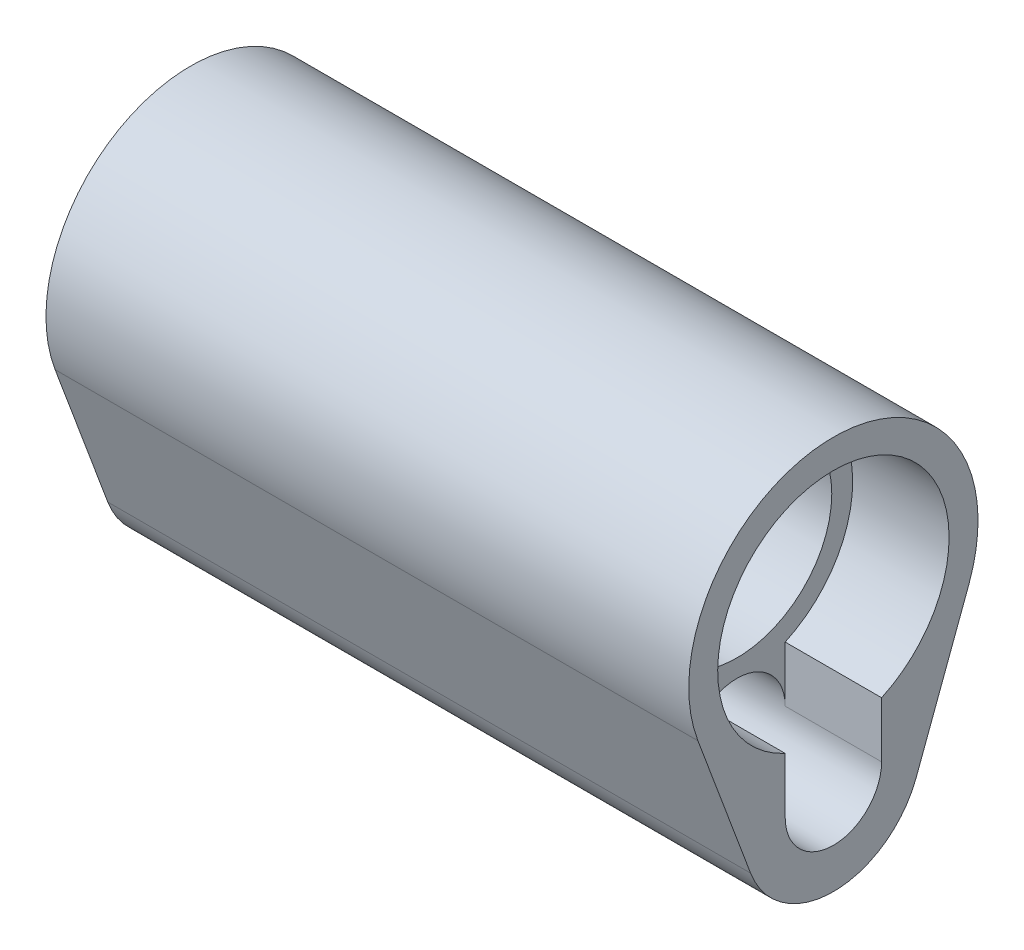
ISO-10303-21;
HEADER;
FILE_DESCRIPTION(('STEP AP214'),'2;1');
FILE_NAME('part.step','',(''),(''),'','','');
FILE_SCHEMA(('AUTOMOTIVE_DESIGN { 1 0 10303 214 1 1 1 1 }'));
ENDSEC;
DATA;
#1=APPLICATION_CONTEXT('core data for automotive mechanical design processes');
#2=APPLICATION_PROTOCOL_DEFINITION('international standard','automotive_design',2000,#1);
#3=PRODUCT_CONTEXT('',#1,'mechanical');
#4=PRODUCT('Part','Part','',(#3));
#5=PRODUCT_RELATED_PRODUCT_CATEGORY('part','',(#4));
#6=PRODUCT_DEFINITION_FORMATION('','',#4);
#7=PRODUCT_DEFINITION_CONTEXT('part definition',#1,'design');
#8=PRODUCT_DEFINITION('design','',#6,#7);
#9=PRODUCT_DEFINITION_SHAPE('','',#8);
#10=(LENGTH_UNIT() NAMED_UNIT(*) SI_UNIT(.MILLI.,.METRE.));
#11=(NAMED_UNIT(*) PLANE_ANGLE_UNIT() SI_UNIT($,.RADIAN.));
#12=(NAMED_UNIT(*) SI_UNIT($,.STERADIAN.) SOLID_ANGLE_UNIT());
#13=UNCERTAINTY_MEASURE_WITH_UNIT(LENGTH_MEASURE(1.E-05),#10,'distance_accuracy_value','');
#14=(GEOMETRIC_REPRESENTATION_CONTEXT(3) GLOBAL_UNCERTAINTY_ASSIGNED_CONTEXT((#13)) GLOBAL_UNIT_ASSIGNED_CONTEXT((#10,
#11,#12)) REPRESENTATION_CONTEXT('',''));
#15=CARTESIAN_POINT('',(0.,0.,0.));
#16=DIRECTION('',(0.,0.,1.));
#17=DIRECTION('',(1.,0.,0.));
#18=AXIS2_PLACEMENT_3D('',#15,#16,#17);
#19=CARTESIAN_POINT('',(20.,0.,0.));
#20=DIRECTION('',(-1.,0.,0.));
#21=DIRECTION('',(0.,0.,1.));
#22=AXIS2_PLACEMENT_3D('',#19,#20,#21);
#23=CYLINDRICAL_SURFACE('',#22,2.95);
#24=CARTESIAN_POINT('',(0.,0.,0.));
#25=DIRECTION('',(1.,0.,0.));
#26=DIRECTION('',(0.,0.,-1.));
#27=AXIS2_PLACEMENT_3D('',#24,#25,#26);
#28=CIRCLE('',#27,2.95);
#29=CARTESIAN_POINT('',(0.,0.,-2.95));
#30=VERTEX_POINT('',#29);
#31=EDGE_CURVE('E141',#30,#30,#28,.T.);
#32=ORIENTED_EDGE('',*,*,#31,.F.);
#33=EDGE_LOOP('',(#32));
#34=FACE_BOUND('',#33,.T.);
#35=CARTESIAN_POINT('',(17.,0.,0.));
#36=DIRECTION('',(1.,0.,0.));
#37=DIRECTION('',(0.,0.,-1.));
#38=AXIS2_PLACEMENT_3D('',#35,#36,#37);
#39=CIRCLE('',#38,2.95);
#40=CARTESIAN_POINT('',(17.,0.,-2.95));
#41=VERTEX_POINT('',#40);
#42=EDGE_CURVE('E136',#41,#41,#39,.T.);
#43=ORIENTED_EDGE('',*,*,#42,.T.);
#44=EDGE_LOOP('',(#43));
#45=FACE_BOUND('',#44,.T.);
#46=ADVANCED_FACE('F35',(#34,#45),#23,.F.);
#47=CARTESIAN_POINT('',(20.,0.,0.));
#48=DIRECTION('',(1.,0.,0.));
#49=DIRECTION('',(0.,0.,-1.));
#50=AXIS2_PLACEMENT_3D('',#47,#48,#49);
#51=PLANE('',#50);
#52=DIRECTION('',(0.,-1.,0.));
#53=VECTOR('',#52,1.);
#54=CARTESIAN_POINT('',(20.,-5.,1.5));
#55=LINE('',#54,#53);
#56=CARTESIAN_POINT('',(20.,-3.27261363439071,1.5));
#57=VERTEX_POINT('',#56);
#58=CARTESIAN_POINT('',(20.,-5.,1.5));
#59=VERTEX_POINT('',#58);
#60=EDGE_CURVE('E288',#57,#59,#55,.T.);
#61=ORIENTED_EDGE('',*,*,#60,.F.);
#62=CARTESIAN_POINT('',(20.,0.,0.));
#63=DIRECTION('',(1.,0.,0.));
#64=DIRECTION('',(0.,0.,-1.));
#65=AXIS2_PLACEMENT_3D('',#62,#63,#64);
#66=CIRCLE('',#65,3.6);
#67=CARTESIAN_POINT('',(20.,-3.27261363439071,-1.5));
#68=VERTEX_POINT('',#67);
#69=EDGE_CURVE('E285',#68,#57,#66,.T.);
#70=ORIENTED_EDGE('',*,*,#69,.F.);
#71=DIRECTION('',(0.,1.,0.));
#72=VECTOR('',#71,1.);
#73=CARTESIAN_POINT('',(20.,-5.,-1.5));
#74=LINE('',#73,#72);
#75=CARTESIAN_POINT('',(20.,-5.,-1.5));
#76=VERTEX_POINT('',#75);
#77=EDGE_CURVE('E286',#76,#68,#74,.T.);
#78=ORIENTED_EDGE('',*,*,#77,.F.);
#79=CARTESIAN_POINT('',(20.,-5.,0.));
#80=DIRECTION('',(1.,0.,0.));
#81=DIRECTION('',(0.,0.,-1.));
#82=AXIS2_PLACEMENT_3D('',#79,#80,#81);
#83=CIRCLE('',#82,1.5);
#84=EDGE_CURVE('E128',#59,#76,#83,.T.);
#85=ORIENTED_EDGE('',*,*,#84,.F.);
#86=EDGE_LOOP('',(#61,#70,#78,#85));
#87=FACE_BOUND('',#86,.T.);
#88=CARTESIAN_POINT('',(20.,0.,0.));
#89=DIRECTION('',(1.,0.,0.));
#90=DIRECTION('',(0.,0.,-1.));
#91=AXIS2_PLACEMENT_3D('',#88,#89,#90);
#92=CIRCLE('',#91,4.5);
#93=CARTESIAN_POINT('',(20.,-1.575,-4.21537364891892));
#94=VERTEX_POINT('',#93);
#95=CARTESIAN_POINT('',(20.,-1.575,4.21537364891892));
#96=VERTEX_POINT('',#95);
#97=EDGE_CURVE('E147',#94,#96,#92,.T.);
#98=ORIENTED_EDGE('',*,*,#97,.T.);
#99=DIRECTION('',(0.,-0.93674969975976,-0.35));
#100=VECTOR('',#99,1.);
#101=CARTESIAN_POINT('',(20.,-1.575,4.21537364891892));
#102=LINE('',#101,#100);
#103=CARTESIAN_POINT('',(20.,-5.9625,2.57606167433934));
#104=VERTEX_POINT('',#103);
#105=EDGE_CURVE('E88',#96,#104,#102,.T.);
#106=ORIENTED_EDGE('',*,*,#105,.T.);
#107=CARTESIAN_POINT('',(20.,-5.,0.));
#108=DIRECTION('',(1.,0.,0.));
#109=DIRECTION('',(0.,0.,-1.));
#110=AXIS2_PLACEMENT_3D('',#107,#108,#109);
#111=CIRCLE('',#110,2.75);
#112=CARTESIAN_POINT('',(20.,-5.9625,-2.57606167433934));
#113=VERTEX_POINT('',#112);
#114=EDGE_CURVE('E150',#104,#113,#111,.T.);
#115=ORIENTED_EDGE('',*,*,#114,.T.);
#116=DIRECTION('',(0.,0.93674969975976,-0.35));
#117=VECTOR('',#116,1.);
#118=CARTESIAN_POINT('',(20.,-1.575,-4.21537364891892));
#119=LINE('',#118,#117);
#120=EDGE_CURVE('E59',#113,#94,#119,.T.);
#121=ORIENTED_EDGE('',*,*,#120,.T.);
#122=EDGE_LOOP('',(#98,#106,#115,#121));
#123=FACE_BOUND('',#122,.T.);
#124=ADVANCED_FACE('F180',(#87,#123),#51,.T.);
#125=CARTESIAN_POINT('',(0.,0.,0.));
#126=DIRECTION('',(1.,0.,0.));
#127=DIRECTION('',(0.,0.,-1.));
#128=AXIS2_PLACEMENT_3D('',#125,#126,#127);
#129=PLANE('',#128);
#130=CARTESIAN_POINT('',(0.,0.,0.));
#131=DIRECTION('',(1.,0.,0.));
#132=DIRECTION('',(0.,0.,-1.));
#133=AXIS2_PLACEMENT_3D('',#130,#131,#132);
#134=CIRCLE('',#133,4.5);
#135=CARTESIAN_POINT('',(0.,-1.575,-4.21537364891892));
#136=VERTEX_POINT('',#135);
#137=CARTESIAN_POINT('',(0.,-1.575,4.21537364891892));
#138=VERTEX_POINT('',#137);
#139=EDGE_CURVE('E146',#136,#138,#134,.T.);
#140=ORIENTED_EDGE('',*,*,#139,.F.);
#141=DIRECTION('',(0.,0.93674969975976,-0.35));
#142=VECTOR('',#141,1.);
#143=CARTESIAN_POINT('',(0.,-1.575,-4.21537364891892));
#144=LINE('',#143,#142);
#145=CARTESIAN_POINT('',(0.,-5.9625,-2.57606167433934));
#146=VERTEX_POINT('',#145);
#147=EDGE_CURVE('E80',#146,#136,#144,.T.);
#148=ORIENTED_EDGE('',*,*,#147,.F.);
#149=CARTESIAN_POINT('',(0.,-5.,0.));
#150=DIRECTION('',(1.,0.,0.));
#151=DIRECTION('',(0.,0.,-1.));
#152=AXIS2_PLACEMENT_3D('',#149,#150,#151);
#153=CIRCLE('',#152,2.75);
#154=CARTESIAN_POINT('',(0.,-5.9625,2.57606167433934));
#155=VERTEX_POINT('',#154);
#156=EDGE_CURVE('E158',#155,#146,#153,.T.);
#157=ORIENTED_EDGE('',*,*,#156,.F.);
#158=DIRECTION('',(0.,-0.93674969975976,-0.35));
#159=VECTOR('',#158,1.);
#160=CARTESIAN_POINT('',(0.,-1.575,4.21537364891892));
#161=LINE('',#160,#159);
#162=EDGE_CURVE('E156',#138,#155,#161,.T.);
#163=ORIENTED_EDGE('',*,*,#162,.F.);
#164=EDGE_LOOP('',(#140,#148,#157,#163));
#165=FACE_BOUND('',#164,.T.);
#166=ORIENTED_EDGE('',*,*,#31,.T.);
#167=EDGE_LOOP('',(#166));
#168=FACE_BOUND('',#167,.T.);
#169=CARTESIAN_POINT('',(0.,-5.,0.));
#170=DIRECTION('',(1.,0.,0.));
#171=DIRECTION('',(0.,0.,-1.));
#172=AXIS2_PLACEMENT_3D('',#169,#170,#171);
#173=CIRCLE('',#172,1.5);
#174=CARTESIAN_POINT('',(0.,-5.,-1.5));
#175=VERTEX_POINT('',#174);
#176=EDGE_CURVE('E139',#175,#175,#173,.T.);
#177=ORIENTED_EDGE('',*,*,#176,.T.);
#178=EDGE_LOOP('',(#177));
#179=FACE_BOUND('',#178,.T.);
#180=ADVANCED_FACE('F172',(#165,#168,#179),#129,.F.);
#181=CARTESIAN_POINT('',(20.,0.,0.));
#182=DIRECTION('',(-1.,0.,0.));
#183=DIRECTION('',(0.,0.,1.));
#184=AXIS2_PLACEMENT_3D('',#181,#182,#183);
#185=CYLINDRICAL_SURFACE('',#184,4.5);
#186=ORIENTED_EDGE('',*,*,#139,.T.);
#187=DIRECTION('',(-1.,0.,0.));
#188=VECTOR('',#187,1.);
#189=CARTESIAN_POINT('',(20.,-1.575,4.21537364891892));
#190=LINE('',#189,#188);
#191=EDGE_CURVE('E43',#96,#138,#190,.T.);
#192=ORIENTED_EDGE('',*,*,#191,.F.);
#193=ORIENTED_EDGE('',*,*,#97,.F.);
#194=DIRECTION('',(-1.,0.,0.));
#195=VECTOR('',#194,1.);
#196=CARTESIAN_POINT('',(20.,-1.575,-4.21537364891892));
#197=LINE('',#196,#195);
#198=EDGE_CURVE('E153',#94,#136,#197,.T.);
#199=ORIENTED_EDGE('',*,*,#198,.T.);
#200=EDGE_LOOP('',(#186,#192,#193,#199));
#201=FACE_BOUND('',#200,.T.);
#202=ADVANCED_FACE('F37',(#201),#185,.T.);
#203=CARTESIAN_POINT('',(20.,-1.575,4.21537364891892));
#204=DIRECTION('',(0.,0.35,-0.93674969975976));
#205=DIRECTION('',(0.,0.93674969975976,0.35));
#206=AXIS2_PLACEMENT_3D('',#203,#204,#205);
#207=PLANE('',#206);
#208=ORIENTED_EDGE('',*,*,#162,.T.);
#209=DIRECTION('',(-1.,0.,0.));
#210=VECTOR('',#209,1.);
#211=CARTESIAN_POINT('',(20.,-5.9625,2.57606167433934));
#212=LINE('',#211,#210);
#213=EDGE_CURVE('E164',#104,#155,#212,.T.);
#214=ORIENTED_EDGE('',*,*,#213,.F.);
#215=ORIENTED_EDGE('',*,*,#105,.F.);
#216=ORIENTED_EDGE('',*,*,#191,.T.);
#217=EDGE_LOOP('',(#208,#214,#215,#216));
#218=FACE_BOUND('',#217,.T.);
#219=ADVANCED_FACE('F167',(#218),#207,.F.);
#220=CARTESIAN_POINT('',(20.,-5.,0.));
#221=DIRECTION('',(-1.,0.,0.));
#222=DIRECTION('',(0.,0.,1.));
#223=AXIS2_PLACEMENT_3D('',#220,#221,#222);
#224=CYLINDRICAL_SURFACE('',#223,2.75);
#225=ORIENTED_EDGE('',*,*,#156,.T.);
#226=DIRECTION('',(-1.,0.,0.));
#227=VECTOR('',#226,1.);
#228=CARTESIAN_POINT('',(20.,-5.9625,-2.57606167433934));
#229=LINE('',#228,#227);
#230=EDGE_CURVE('E162',#113,#146,#229,.T.);
#231=ORIENTED_EDGE('',*,*,#230,.F.);
#232=ORIENTED_EDGE('',*,*,#114,.F.);
#233=ORIENTED_EDGE('',*,*,#213,.T.);
#234=EDGE_LOOP('',(#225,#231,#232,#233));
#235=FACE_BOUND('',#234,.T.);
#236=ADVANCED_FACE('F177',(#235),#224,.T.);
#237=CARTESIAN_POINT('',(20.,-1.575,-4.21537364891892));
#238=DIRECTION('',(0.,0.35,0.93674969975976));
#239=DIRECTION('',(0.,-0.93674969975976,0.35));
#240=AXIS2_PLACEMENT_3D('',#237,#238,#239);
#241=PLANE('',#240);
#242=ORIENTED_EDGE('',*,*,#147,.T.);
#243=ORIENTED_EDGE('',*,*,#198,.F.);
#244=ORIENTED_EDGE('',*,*,#120,.F.);
#245=ORIENTED_EDGE('',*,*,#230,.T.);
#246=EDGE_LOOP('',(#242,#243,#244,#245));
#247=FACE_BOUND('',#246,.T.);
#248=ADVANCED_FACE('F179',(#247),#241,.F.);
#249=CARTESIAN_POINT('',(20.,-5.,0.));
#250=DIRECTION('',(-1.,0.,0.));
#251=DIRECTION('',(0.,0.,1.));
#252=AXIS2_PLACEMENT_3D('',#249,#250,#251);
#253=CYLINDRICAL_SURFACE('',#252,1.5);
#254=DIRECTION('',(1.,0.,0.));
#255=VECTOR('',#254,1.);
#256=CARTESIAN_POINT('',(17.,-5.,1.5));
#257=LINE('',#256,#255);
#258=CARTESIAN_POINT('',(17.,-5.,1.5));
#259=VERTEX_POINT('',#258);
#260=EDGE_CURVE('E129',#259,#59,#257,.T.);
#261=ORIENTED_EDGE('',*,*,#260,.T.);
#262=ORIENTED_EDGE('',*,*,#84,.T.);
#263=DIRECTION('',(1.,0.,0.));
#264=VECTOR('',#263,1.);
#265=CARTESIAN_POINT('',(17.,-5.,-1.5));
#266=LINE('',#265,#264);
#267=CARTESIAN_POINT('',(17.,-5.,-1.5));
#268=VERTEX_POINT('',#267);
#269=EDGE_CURVE('E119',#268,#76,#266,.T.);
#270=ORIENTED_EDGE('',*,*,#269,.F.);
#271=CARTESIAN_POINT('',(17.,-5.,0.));
#272=DIRECTION('',(1.,0.,0.));
#273=DIRECTION('',(0.,0.,-1.));
#274=AXIS2_PLACEMENT_3D('',#271,#272,#273);
#275=CIRCLE('',#274,1.5);
#276=EDGE_CURVE('E11',#268,#259,#275,.T.);
#277=ORIENTED_EDGE('',*,*,#276,.T.);
#278=EDGE_LOOP('',(#261,#262,#270,#277));
#279=FACE_BOUND('',#278,.T.);
#280=ORIENTED_EDGE('',*,*,#176,.F.);
#281=EDGE_LOOP('',(#280));
#282=FACE_BOUND('',#281,.T.);
#283=ADVANCED_FACE('F125',(#279,#282),#253,.F.);
#284=CARTESIAN_POINT('',(17.,-5.,1.5));
#285=DIRECTION('',(0.,0.,1.));
#286=DIRECTION('',(1.,0.,0.));
#287=AXIS2_PLACEMENT_3D('',#284,#285,#286);
#288=PLANE('',#287);
#289=ORIENTED_EDGE('',*,*,#60,.T.);
#290=ORIENTED_EDGE('',*,*,#260,.F.);
#291=DIRECTION('',(0.,-1.,0.));
#292=VECTOR('',#291,1.);
#293=CARTESIAN_POINT('',(17.,-5.,1.5));
#294=LINE('',#293,#292);
#295=CARTESIAN_POINT('',(17.,-3.27261363439071,1.5));
#296=VERTEX_POINT('',#295);
#297=EDGE_CURVE('E50',#296,#259,#294,.T.);
#298=ORIENTED_EDGE('',*,*,#297,.F.);
#299=DIRECTION('',(1.,0.,0.));
#300=VECTOR('',#299,1.);
#301=CARTESIAN_POINT('',(17.,-3.27261363439071,1.5));
#302=LINE('',#301,#300);
#303=EDGE_CURVE('E131',#296,#57,#302,.T.);
#304=ORIENTED_EDGE('',*,*,#303,.T.);
#305=EDGE_LOOP('',(#289,#290,#298,#304));
#306=FACE_BOUND('',#305,.T.);
#307=ADVANCED_FACE('F237',(#306),#288,.F.);
#308=CARTESIAN_POINT('',(17.,0.,0.));
#309=DIRECTION('',(1.,0.,0.));
#310=DIRECTION('',(0.,0.,-1.));
#311=AXIS2_PLACEMENT_3D('',#308,#309,#310);
#312=CYLINDRICAL_SURFACE('',#311,3.6);
#313=ORIENTED_EDGE('',*,*,#69,.T.);
#314=ORIENTED_EDGE('',*,*,#303,.F.);
#315=CARTESIAN_POINT('',(17.,0.,0.));
#316=DIRECTION('',(1.,0.,0.));
#317=DIRECTION('',(0.,0.,-1.));
#318=AXIS2_PLACEMENT_3D('',#315,#316,#317);
#319=CIRCLE('',#318,3.6);
#320=CARTESIAN_POINT('',(17.,-3.27261363439071,-1.5));
#321=VERTEX_POINT('',#320);
#322=EDGE_CURVE('E122',#321,#296,#319,.T.);
#323=ORIENTED_EDGE('',*,*,#322,.F.);
#324=DIRECTION('',(1.,0.,0.));
#325=VECTOR('',#324,1.);
#326=CARTESIAN_POINT('',(17.,-3.27261363439071,-1.5));
#327=LINE('',#326,#325);
#328=EDGE_CURVE('E121',#321,#68,#327,.T.);
#329=ORIENTED_EDGE('',*,*,#328,.T.);
#330=EDGE_LOOP('',(#313,#314,#323,#329));
#331=FACE_BOUND('',#330,.T.);
#332=ADVANCED_FACE('F248',(#331),#312,.F.);
#333=CARTESIAN_POINT('',(17.,-5.,-1.5));
#334=DIRECTION('',(0.,0.,-1.));
#335=DIRECTION('',(-1.,0.,0.));
#336=AXIS2_PLACEMENT_3D('',#333,#334,#335);
#337=PLANE('',#336);
#338=ORIENTED_EDGE('',*,*,#77,.T.);
#339=ORIENTED_EDGE('',*,*,#328,.F.);
#340=DIRECTION('',(0.,1.,0.));
#341=VECTOR('',#340,1.);
#342=CARTESIAN_POINT('',(17.,-5.,-1.5));
#343=LINE('',#342,#341);
#344=EDGE_CURVE('E111',#268,#321,#343,.T.);
#345=ORIENTED_EDGE('',*,*,#344,.F.);
#346=ORIENTED_EDGE('',*,*,#269,.T.);
#347=EDGE_LOOP('',(#338,#339,#345,#346));
#348=FACE_BOUND('',#347,.T.);
#349=ADVANCED_FACE('F118',(#348),#337,.F.);
#350=CARTESIAN_POINT('',(17.,0.,0.));
#351=DIRECTION('',(1.,0.,0.));
#352=DIRECTION('',(0.,0.,-1.));
#353=AXIS2_PLACEMENT_3D('',#350,#351,#352);
#354=PLANE('',#353);
#355=ORIENTED_EDGE('',*,*,#42,.F.);
#356=EDGE_LOOP('',(#355));
#357=FACE_BOUND('',#356,.T.);
#358=ORIENTED_EDGE('',*,*,#344,.T.);
#359=ORIENTED_EDGE('',*,*,#322,.T.);
#360=ORIENTED_EDGE('',*,*,#297,.T.);
#361=ORIENTED_EDGE('',*,*,#276,.F.);
#362=EDGE_LOOP('',(#358,#359,#360,#361));
#363=FACE_BOUND('',#362,.T.);
#364=ADVANCED_FACE('F110',(#357,#363),#354,.T.);
#365=CLOSED_SHELL('',(#46,#124,#180,#202,#219,#236,#248,#283,#307,#332,#349,#364));
#366=MANIFOLD_SOLID_BREP('B2',#365);
#367=ADVANCED_BREP_SHAPE_REPRESENTATION('',(#18,#366),#14);
#368=SHAPE_DEFINITION_REPRESENTATION(#9,#367);
ENDSEC;
END-ISO-10303-21;
